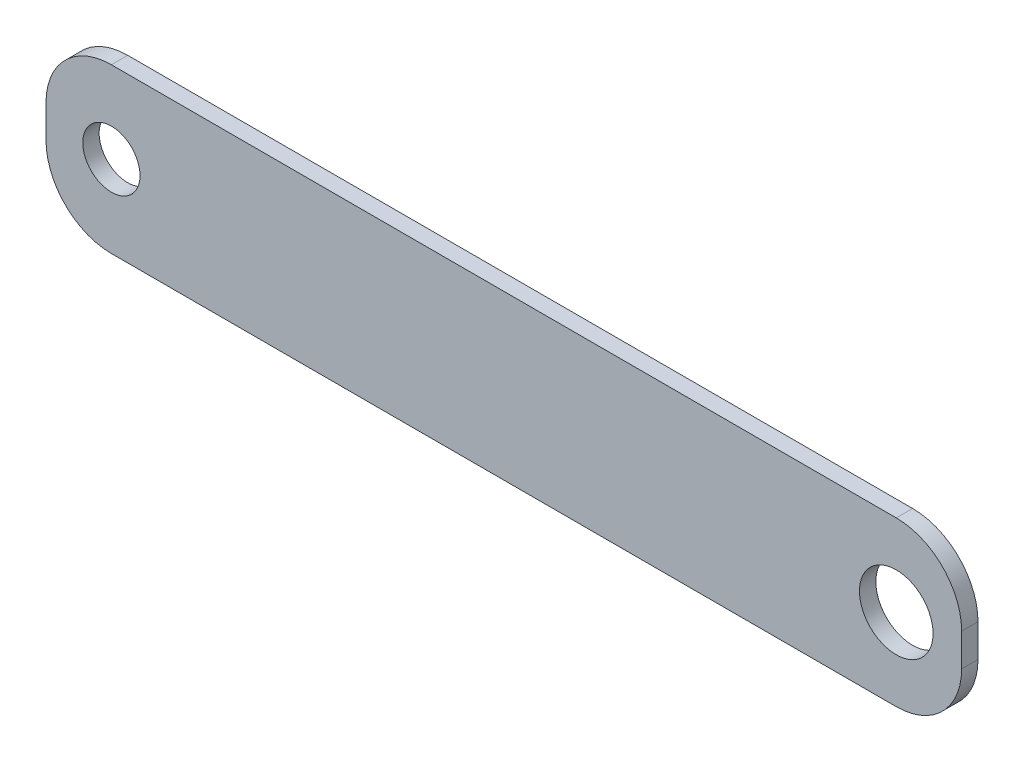
ISO-10303-21;
HEADER;
FILE_DESCRIPTION(('STEP AP214'),'2;1');
FILE_NAME('part.step','',(''),(''),'','','');
FILE_SCHEMA(('AUTOMOTIVE_DESIGN { 1 0 10303 214 1 1 1 1 }'));
ENDSEC;
DATA;
#1=APPLICATION_CONTEXT('core data for automotive mechanical design processes');
#2=APPLICATION_PROTOCOL_DEFINITION('international standard','automotive_design',2000,#1);
#3=PRODUCT_CONTEXT('',#1,'mechanical');
#4=PRODUCT('Part','Part','',(#3));
#5=PRODUCT_RELATED_PRODUCT_CATEGORY('part','',(#4));
#6=PRODUCT_DEFINITION_FORMATION('','',#4);
#7=PRODUCT_DEFINITION_CONTEXT('part definition',#1,'design');
#8=PRODUCT_DEFINITION('design','',#6,#7);
#9=PRODUCT_DEFINITION_SHAPE('','',#8);
#10=(LENGTH_UNIT() NAMED_UNIT(*) SI_UNIT(.MILLI.,.METRE.));
#11=(NAMED_UNIT(*) PLANE_ANGLE_UNIT() SI_UNIT($,.RADIAN.));
#12=(NAMED_UNIT(*) SI_UNIT($,.STERADIAN.) SOLID_ANGLE_UNIT());
#13=UNCERTAINTY_MEASURE_WITH_UNIT(LENGTH_MEASURE(1.E-05),#10,'distance_accuracy_value','');
#14=(GEOMETRIC_REPRESENTATION_CONTEXT(3) GLOBAL_UNCERTAINTY_ASSIGNED_CONTEXT((#13)) GLOBAL_UNIT_ASSIGNED_CONTEXT((#10,
#11,#12)) REPRESENTATION_CONTEXT('',''));
#15=CARTESIAN_POINT('',(0.,0.,0.));
#16=DIRECTION('',(0.,0.,1.));
#17=DIRECTION('',(1.,0.,0.));
#18=AXIS2_PLACEMENT_3D('',#15,#16,#17);
#19=CARTESIAN_POINT('',(341.76482123998,69.8499999999999,6.35));
#20=DIRECTION('',(0.,0.,1.));
#21=DIRECTION('',(1.,0.,0.));
#22=AXIS2_PLACEMENT_3D('',#19,#20,#21);
#23=PLANE('',#22);
#24=CARTESIAN_POINT('',(36.9648212399797,76.2,6.35));
#25=DIRECTION('',(0.,0.,1.));
#26=DIRECTION('',(1.,0.,0.));
#27=AXIS2_PLACEMENT_3D('',#24,#25,#26);
#28=CIRCLE('',#27,11.1125);
#29=CARTESIAN_POINT('',(48.0773212399797,76.2,6.35));
#30=VERTEX_POINT('',#29);
#31=EDGE_CURVE('E137',#30,#30,#28,.T.);
#32=ORIENTED_EDGE('',*,*,#31,.F.);
#33=EDGE_LOOP('',(#32));
#34=FACE_BOUND('',#33,.T.);
#35=CARTESIAN_POINT('',(341.76482123998,69.8499999999999,6.35));
#36=DIRECTION('',(0.,0.,1.));
#37=DIRECTION('',(1.,0.,0.));
#38=AXIS2_PLACEMENT_3D('',#35,#36,#37);
#39=CIRCLE('',#38,25.4);
#40=CARTESIAN_POINT('',(341.764821239979,44.4499999999999,6.35));
#41=VERTEX_POINT('',#40);
#42=CARTESIAN_POINT('',(367.16482123998,69.8500000000001,6.35));
#43=VERTEX_POINT('',#42);
#44=EDGE_CURVE('E149',#41,#43,#39,.T.);
#45=ORIENTED_EDGE('',*,*,#44,.T.);
#46=DIRECTION('',(0.,1.,0.));
#47=VECTOR('',#46,1.);
#48=CARTESIAN_POINT('',(367.16482123998,69.8500000000001,6.35));
#49=LINE('',#48,#47);
#50=CARTESIAN_POINT('',(367.16482123998,82.5499999999998,6.35));
#51=VERTEX_POINT('',#50);
#52=EDGE_CURVE('E96',#43,#51,#49,.T.);
#53=ORIENTED_EDGE('',*,*,#52,.T.);
#54=CARTESIAN_POINT('',(341.76482123998,82.55,6.35));
#55=DIRECTION('',(0.,0.,1.));
#56=DIRECTION('',(-1.,0.,0.));
#57=AXIS2_PLACEMENT_3D('',#54,#55,#56);
#58=CIRCLE('',#57,25.4);
#59=CARTESIAN_POINT('',(341.764821239979,107.95,6.35));
#60=VERTEX_POINT('',#59);
#61=EDGE_CURVE('E164',#51,#60,#58,.T.);
#62=ORIENTED_EDGE('',*,*,#61,.T.);
#63=DIRECTION('',(-1.,0.,0.));
#64=VECTOR('',#63,1.);
#65=CARTESIAN_POINT('',(324.969720877316,107.95,6.35));
#66=LINE('',#65,#64);
#67=CARTESIAN_POINT('',(36.9648212399799,107.95,6.35));
#68=VERTEX_POINT('',#67);
#69=EDGE_CURVE('E176',#60,#68,#66,.T.);
#70=ORIENTED_EDGE('',*,*,#69,.T.);
#71=CARTESIAN_POINT('',(36.9648212399797,82.55,6.35));
#72=DIRECTION('',(0.,0.,1.));
#73=DIRECTION('',(-1.,0.,0.));
#74=AXIS2_PLACEMENT_3D('',#71,#72,#73);
#75=CIRCLE('',#74,25.4);
#76=CARTESIAN_POINT('',(11.5648212399797,82.5499999999998,6.35));
#77=VERTEX_POINT('',#76);
#78=EDGE_CURVE('E115',#68,#77,#75,.T.);
#79=ORIENTED_EDGE('',*,*,#78,.T.);
#80=DIRECTION('',(0.,-1.,0.));
#81=VECTOR('',#80,1.);
#82=CARTESIAN_POINT('',(11.5648212399797,69.8500000000002,6.35));
#83=LINE('',#82,#81);
#84=CARTESIAN_POINT('',(11.5648212399797,69.85,6.35));
#85=VERTEX_POINT('',#84);
#86=EDGE_CURVE('E109',#77,#85,#83,.T.);
#87=ORIENTED_EDGE('',*,*,#86,.T.);
#88=CARTESIAN_POINT('',(36.9648212399797,69.85,6.35));
#89=DIRECTION('',(0.,0.,1.));
#90=DIRECTION('',(-1.,0.,0.));
#91=AXIS2_PLACEMENT_3D('',#88,#89,#90);
#92=CIRCLE('',#91,25.4);
#93=CARTESIAN_POINT('',(36.9648212399799,44.45,6.35));
#94=VERTEX_POINT('',#93);
#95=EDGE_CURVE('E113',#85,#94,#92,.T.);
#96=ORIENTED_EDGE('',*,*,#95,.T.);
#97=DIRECTION('',(1.,0.,0.));
#98=VECTOR('',#97,1.);
#99=CARTESIAN_POINT('',(36.9648212399799,44.45,6.35));
#100=LINE('',#99,#98);
#101=EDGE_CURVE('E53',#94,#41,#100,.T.);
#102=ORIENTED_EDGE('',*,*,#101,.T.);
#103=EDGE_LOOP('',(#45,#53,#62,#70,#79,#87,#96,#102));
#104=FACE_BOUND('',#103,.T.);
#105=CARTESIAN_POINT('',(341.76482123998,76.2,6.35));
#106=DIRECTION('',(0.,0.,1.));
#107=DIRECTION('',(1.,0.,0.));
#108=AXIS2_PLACEMENT_3D('',#105,#106,#107);
#109=CIRCLE('',#108,14.2875);
#110=CARTESIAN_POINT('',(356.05232123998,76.2,6.35));
#111=VERTEX_POINT('',#110);
#112=EDGE_CURVE('E185',#111,#111,#109,.T.);
#113=ORIENTED_EDGE('',*,*,#112,.F.);
#114=EDGE_LOOP('',(#113));
#115=FACE_BOUND('',#114,.T.);
#116=ADVANCED_FACE('F36',(#34,#104,#115),#23,.T.);
#117=CARTESIAN_POINT('',(341.76482123998,69.8499999999999,0.));
#118=DIRECTION('',(0.,0.,1.));
#119=DIRECTION('',(1.,0.,0.));
#120=AXIS2_PLACEMENT_3D('',#117,#118,#119);
#121=PLANE('',#120);
#122=CARTESIAN_POINT('',(341.76482123998,69.8499999999999,0.));
#123=DIRECTION('',(0.,0.,1.));
#124=DIRECTION('',(1.,0.,0.));
#125=AXIS2_PLACEMENT_3D('',#122,#123,#124);
#126=CIRCLE('',#125,25.4);
#127=CARTESIAN_POINT('',(341.764821239979,44.4499999999999,0.));
#128=VERTEX_POINT('',#127);
#129=CARTESIAN_POINT('',(367.16482123998,69.8500000000001,0.));
#130=VERTEX_POINT('',#129);
#131=EDGE_CURVE('E133',#128,#130,#126,.T.);
#132=ORIENTED_EDGE('',*,*,#131,.F.);
#133=DIRECTION('',(1.,0.,0.));
#134=VECTOR('',#133,1.);
#135=CARTESIAN_POINT('',(36.9648212399799,44.45,0.));
#136=LINE('',#135,#134);
#137=CARTESIAN_POINT('',(36.9648212399799,44.45,0.));
#138=VERTEX_POINT('',#137);
#139=EDGE_CURVE('E88',#138,#128,#136,.T.);
#140=ORIENTED_EDGE('',*,*,#139,.F.);
#141=CARTESIAN_POINT('',(36.9648212399797,69.85,0.));
#142=DIRECTION('',(0.,0.,1.));
#143=DIRECTION('',(-1.,0.,0.));
#144=AXIS2_PLACEMENT_3D('',#141,#142,#143);
#145=CIRCLE('',#144,25.4);
#146=CARTESIAN_POINT('',(11.5648212399797,69.85,0.));
#147=VERTEX_POINT('',#146);
#148=EDGE_CURVE('E82',#147,#138,#145,.T.);
#149=ORIENTED_EDGE('',*,*,#148,.F.);
#150=DIRECTION('',(0.,-1.,0.));
#151=VECTOR('',#150,1.);
#152=CARTESIAN_POINT('',(11.5648212399797,69.8500000000002,0.));
#153=LINE('',#152,#151);
#154=CARTESIAN_POINT('',(11.5648212399797,82.5499999999998,0.));
#155=VERTEX_POINT('',#154);
#156=EDGE_CURVE('E123',#155,#147,#153,.T.);
#157=ORIENTED_EDGE('',*,*,#156,.F.);
#158=CARTESIAN_POINT('',(36.9648212399797,82.55,0.));
#159=DIRECTION('',(0.,0.,1.));
#160=DIRECTION('',(-1.,0.,0.));
#161=AXIS2_PLACEMENT_3D('',#158,#159,#160);
#162=CIRCLE('',#161,25.4);
#163=CARTESIAN_POINT('',(36.9648212399799,107.95,0.));
#164=VERTEX_POINT('',#163);
#165=EDGE_CURVE('E144',#164,#155,#162,.T.);
#166=ORIENTED_EDGE('',*,*,#165,.F.);
#167=DIRECTION('',(-1.,0.,0.));
#168=VECTOR('',#167,1.);
#169=CARTESIAN_POINT('',(36.9648212399799,107.95,0.));
#170=LINE('',#169,#168);
#171=CARTESIAN_POINT('',(341.764821239979,107.95,0.));
#172=VERTEX_POINT('',#171);
#173=EDGE_CURVE('E142',#172,#164,#170,.T.);
#174=ORIENTED_EDGE('',*,*,#173,.F.);
#175=CARTESIAN_POINT('',(341.76482123998,82.55,0.));
#176=DIRECTION('',(0.,0.,1.));
#177=DIRECTION('',(-1.,0.,0.));
#178=AXIS2_PLACEMENT_3D('',#175,#176,#177);
#179=CIRCLE('',#178,25.4);
#180=CARTESIAN_POINT('',(367.16482123998,82.5499999999998,0.));
#181=VERTEX_POINT('',#180);
#182=EDGE_CURVE('E139',#181,#172,#179,.T.);
#183=ORIENTED_EDGE('',*,*,#182,.F.);
#184=DIRECTION('',(0.,1.,0.));
#185=VECTOR('',#184,1.);
#186=CARTESIAN_POINT('',(367.16482123998,69.8500000000001,0.));
#187=LINE('',#186,#185);
#188=EDGE_CURVE('E136',#130,#181,#187,.T.);
#189=ORIENTED_EDGE('',*,*,#188,.F.);
#190=EDGE_LOOP('',(#132,#140,#149,#157,#166,#174,#183,#189));
#191=FACE_BOUND('',#190,.T.);
#192=CARTESIAN_POINT('',(36.9648212399797,76.2,0.));
#193=DIRECTION('',(0.,0.,1.));
#194=DIRECTION('',(1.,0.,0.));
#195=AXIS2_PLACEMENT_3D('',#192,#193,#194);
#196=CIRCLE('',#195,11.1125);
#197=CARTESIAN_POINT('',(48.0773212399797,76.2,0.));
#198=VERTEX_POINT('',#197);
#199=EDGE_CURVE('E182',#198,#198,#196,.T.);
#200=ORIENTED_EDGE('',*,*,#199,.T.);
#201=EDGE_LOOP('',(#200));
#202=FACE_BOUND('',#201,.T.);
#203=CARTESIAN_POINT('',(341.76482123998,76.2,0.));
#204=DIRECTION('',(0.,0.,1.));
#205=DIRECTION('',(1.,0.,0.));
#206=AXIS2_PLACEMENT_3D('',#203,#204,#205);
#207=CIRCLE('',#206,14.2875);
#208=CARTESIAN_POINT('',(356.05232123998,76.2,0.));
#209=VERTEX_POINT('',#208);
#210=EDGE_CURVE('E188',#209,#209,#207,.T.);
#211=ORIENTED_EDGE('',*,*,#210,.T.);
#212=EDGE_LOOP('',(#211));
#213=FACE_BOUND('',#212,.T.);
#214=ADVANCED_FACE('F167',(#191,#202,#213),#121,.F.);
#215=CARTESIAN_POINT('',(341.76482123998,69.8499999999999,6.35));
#216=DIRECTION('',(0.,0.,-1.));
#217=DIRECTION('',(-1.,0.,0.));
#218=AXIS2_PLACEMENT_3D('',#215,#216,#217);
#219=CYLINDRICAL_SURFACE('',#218,25.4);
#220=ORIENTED_EDGE('',*,*,#131,.T.);
#221=DIRECTION('',(0.,0.,-1.));
#222=VECTOR('',#221,1.);
#223=CARTESIAN_POINT('',(367.16482123998,69.8500000000001,6.35));
#224=LINE('',#223,#222);
#225=EDGE_CURVE('E11',#43,#130,#224,.T.);
#226=ORIENTED_EDGE('',*,*,#225,.F.);
#227=ORIENTED_EDGE('',*,*,#44,.F.);
#228=DIRECTION('',(0.,0.,-1.));
#229=VECTOR('',#228,1.);
#230=CARTESIAN_POINT('',(341.764821239979,44.4499999999999,6.35));
#231=LINE('',#230,#229);
#232=EDGE_CURVE('E129',#41,#128,#231,.T.);
#233=ORIENTED_EDGE('',*,*,#232,.T.);
#234=EDGE_LOOP('',(#220,#226,#227,#233));
#235=FACE_BOUND('',#234,.T.);
#236=ADVANCED_FACE('F38',(#235),#219,.T.);
#237=CARTESIAN_POINT('',(367.16482123998,69.8500000000001,6.35));
#238=DIRECTION('',(-1.,0.,0.));
#239=DIRECTION('',(0.,0.,1.));
#240=AXIS2_PLACEMENT_3D('',#237,#238,#239);
#241=PLANE('',#240);
#242=ORIENTED_EDGE('',*,*,#188,.T.);
#243=DIRECTION('',(0.,0.,-1.));
#244=VECTOR('',#243,1.);
#245=CARTESIAN_POINT('',(367.16482123998,82.5499999999998,6.35));
#246=LINE('',#245,#244);
#247=EDGE_CURVE('E45',#51,#181,#246,.T.);
#248=ORIENTED_EDGE('',*,*,#247,.F.);
#249=ORIENTED_EDGE('',*,*,#52,.F.);
#250=ORIENTED_EDGE('',*,*,#225,.T.);
#251=EDGE_LOOP('',(#242,#248,#249,#250));
#252=FACE_BOUND('',#251,.T.);
#253=ADVANCED_FACE('F220',(#252),#241,.F.);
#254=CARTESIAN_POINT('',(341.76482123998,82.55,6.35));
#255=DIRECTION('',(0.,0.,-1.));
#256=DIRECTION('',(-1.,0.,0.));
#257=AXIS2_PLACEMENT_3D('',#254,#255,#256);
#258=CYLINDRICAL_SURFACE('',#257,25.4);
#259=ORIENTED_EDGE('',*,*,#182,.T.);
#260=DIRECTION('',(0.,0.,-1.));
#261=VECTOR('',#260,1.);
#262=CARTESIAN_POINT('',(341.764821239979,107.95,6.35));
#263=LINE('',#262,#261);
#264=EDGE_CURVE('E156',#60,#172,#263,.T.);
#265=ORIENTED_EDGE('',*,*,#264,.F.);
#266=ORIENTED_EDGE('',*,*,#61,.F.);
#267=ORIENTED_EDGE('',*,*,#247,.T.);
#268=EDGE_LOOP('',(#259,#265,#266,#267));
#269=FACE_BOUND('',#268,.T.);
#270=ADVANCED_FACE('F162',(#269),#258,.T.);
#271=CARTESIAN_POINT('',(36.9648212399799,107.95,6.35));
#272=DIRECTION('',(0.,-1.,0.));
#273=DIRECTION('',(1.,0.,0.));
#274=AXIS2_PLACEMENT_3D('',#271,#272,#273);
#275=PLANE('',#274);
#276=ORIENTED_EDGE('',*,*,#173,.T.);
#277=DIRECTION('',(0.,0.,-1.));
#278=VECTOR('',#277,1.);
#279=CARTESIAN_POINT('',(36.9648212399799,107.95,6.35));
#280=LINE('',#279,#278);
#281=EDGE_CURVE('E153',#68,#164,#280,.T.);
#282=ORIENTED_EDGE('',*,*,#281,.F.);
#283=ORIENTED_EDGE('',*,*,#69,.F.);
#284=ORIENTED_EDGE('',*,*,#264,.T.);
#285=EDGE_LOOP('',(#276,#282,#283,#284));
#286=FACE_BOUND('',#285,.T.);
#287=ADVANCED_FACE('F172',(#286),#275,.F.);
#288=CARTESIAN_POINT('',(36.9648212399797,82.55,6.35));
#289=DIRECTION('',(0.,0.,-1.));
#290=DIRECTION('',(-1.,0.,0.));
#291=AXIS2_PLACEMENT_3D('',#288,#289,#290);
#292=CYLINDRICAL_SURFACE('',#291,25.4);
#293=ORIENTED_EDGE('',*,*,#165,.T.);
#294=DIRECTION('',(0.,0.,-1.));
#295=VECTOR('',#294,1.);
#296=CARTESIAN_POINT('',(11.5648212399797,82.5499999999998,6.35));
#297=LINE('',#296,#295);
#298=EDGE_CURVE('E124',#77,#155,#297,.T.);
#299=ORIENTED_EDGE('',*,*,#298,.F.);
#300=ORIENTED_EDGE('',*,*,#78,.F.);
#301=ORIENTED_EDGE('',*,*,#281,.T.);
#302=EDGE_LOOP('',(#293,#299,#300,#301));
#303=FACE_BOUND('',#302,.T.);
#304=ADVANCED_FACE('F175',(#303),#292,.T.);
#305=CARTESIAN_POINT('',(11.5648212399797,69.8500000000002,6.35));
#306=DIRECTION('',(1.,0.,0.));
#307=DIRECTION('',(0.,0.,-1.));
#308=AXIS2_PLACEMENT_3D('',#305,#306,#307);
#309=PLANE('',#308);
#310=ORIENTED_EDGE('',*,*,#156,.T.);
#311=DIRECTION('',(0.,0.,-1.));
#312=VECTOR('',#311,1.);
#313=CARTESIAN_POINT('',(11.5648212399797,69.85,6.35));
#314=LINE('',#313,#312);
#315=EDGE_CURVE('E120',#85,#147,#314,.T.);
#316=ORIENTED_EDGE('',*,*,#315,.F.);
#317=ORIENTED_EDGE('',*,*,#86,.F.);
#318=ORIENTED_EDGE('',*,*,#298,.T.);
#319=EDGE_LOOP('',(#310,#316,#317,#318));
#320=FACE_BOUND('',#319,.T.);
#321=ADVANCED_FACE('F121',(#320),#309,.F.);
#322=CARTESIAN_POINT('',(36.9648212399797,69.85,6.35));
#323=DIRECTION('',(0.,0.,-1.));
#324=DIRECTION('',(-1.,0.,0.));
#325=AXIS2_PLACEMENT_3D('',#322,#323,#324);
#326=CYLINDRICAL_SURFACE('',#325,25.4);
#327=ORIENTED_EDGE('',*,*,#148,.T.);
#328=DIRECTION('',(0.,0.,-1.));
#329=VECTOR('',#328,1.);
#330=CARTESIAN_POINT('',(36.9648212399799,44.45,6.35));
#331=LINE('',#330,#329);
#332=EDGE_CURVE('E125',#94,#138,#331,.T.);
#333=ORIENTED_EDGE('',*,*,#332,.F.);
#334=ORIENTED_EDGE('',*,*,#95,.F.);
#335=ORIENTED_EDGE('',*,*,#315,.T.);
#336=EDGE_LOOP('',(#327,#333,#334,#335));
#337=FACE_BOUND('',#336,.T.);
#338=ADVANCED_FACE('F127',(#337),#326,.T.);
#339=CARTESIAN_POINT('',(36.9648212399799,44.45,6.35));
#340=DIRECTION('',(0.,1.,0.));
#341=DIRECTION('',(-1.,0.,0.));
#342=AXIS2_PLACEMENT_3D('',#339,#340,#341);
#343=PLANE('',#342);
#344=ORIENTED_EDGE('',*,*,#139,.T.);
#345=ORIENTED_EDGE('',*,*,#232,.F.);
#346=ORIENTED_EDGE('',*,*,#101,.F.);
#347=ORIENTED_EDGE('',*,*,#332,.T.);
#348=EDGE_LOOP('',(#344,#345,#346,#347));
#349=FACE_BOUND('',#348,.T.);
#350=ADVANCED_FACE('F208',(#349),#343,.F.);
#351=CARTESIAN_POINT('',(36.9648212399797,76.2,6.35));
#352=DIRECTION('',(0.,0.,-1.));
#353=DIRECTION('',(-1.,0.,0.));
#354=AXIS2_PLACEMENT_3D('',#351,#352,#353);
#355=CYLINDRICAL_SURFACE('',#354,11.1125);
#356=ORIENTED_EDGE('',*,*,#31,.T.);
#357=EDGE_LOOP('',(#356));
#358=FACE_BOUND('',#357,.T.);
#359=ORIENTED_EDGE('',*,*,#199,.F.);
#360=EDGE_LOOP('',(#359));
#361=FACE_BOUND('',#360,.T.);
#362=ADVANCED_FACE('F205',(#358,#361),#355,.F.);
#363=CARTESIAN_POINT('',(341.76482123998,76.2,6.35));
#364=DIRECTION('',(0.,0.,-1.));
#365=DIRECTION('',(-1.,0.,0.));
#366=AXIS2_PLACEMENT_3D('',#363,#364,#365);
#367=CYLINDRICAL_SURFACE('',#366,14.2875);
#368=ORIENTED_EDGE('',*,*,#112,.T.);
#369=EDGE_LOOP('',(#368));
#370=FACE_BOUND('',#369,.T.);
#371=ORIENTED_EDGE('',*,*,#210,.F.);
#372=EDGE_LOOP('',(#371));
#373=FACE_BOUND('',#372,.T.);
#374=ADVANCED_FACE('F194',(#370,#373),#367,.F.);
#375=CLOSED_SHELL('',(#116,#214,#236,#253,#270,#287,#304,#321,#338,#350,#362,#374));
#376=MANIFOLD_SOLID_BREP('B2',#375);
#377=ADVANCED_BREP_SHAPE_REPRESENTATION('',(#18,#376),#14);
#378=SHAPE_DEFINITION_REPRESENTATION(#9,#377);
ENDSEC;
END-ISO-10303-21;
